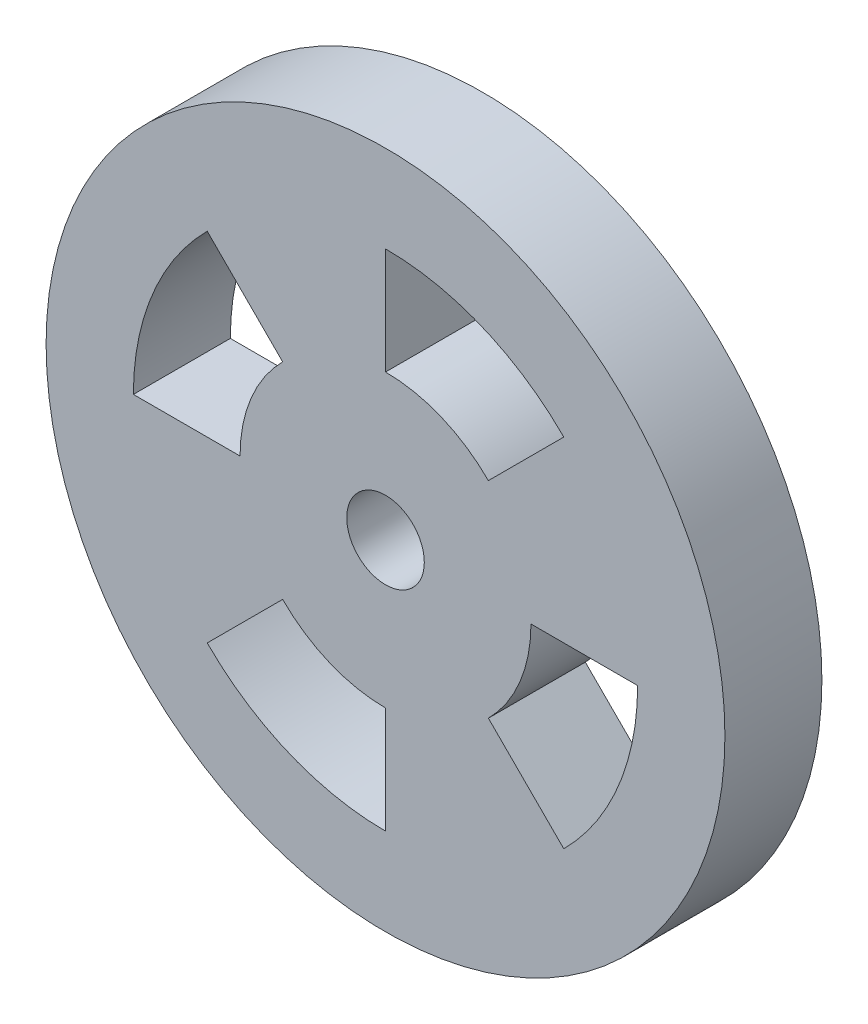
ISO-10303-21;
HEADER;
FILE_DESCRIPTION(('STEP AP214'),'2;1');
FILE_NAME('part.step','',(''),(''),'','','');
FILE_SCHEMA(('AUTOMOTIVE_DESIGN { 1 0 10303 214 1 1 1 1 }'));
ENDSEC;
DATA;
#1=APPLICATION_CONTEXT('core data for automotive mechanical design processes');
#2=APPLICATION_PROTOCOL_DEFINITION('international standard','automotive_design',2000,#1);
#3=PRODUCT_CONTEXT('',#1,'mechanical');
#4=PRODUCT('Part','Part','',(#3));
#5=PRODUCT_RELATED_PRODUCT_CATEGORY('part','',(#4));
#6=PRODUCT_DEFINITION_FORMATION('','',#4);
#7=PRODUCT_DEFINITION_CONTEXT('part definition',#1,'design');
#8=PRODUCT_DEFINITION('design','',#6,#7);
#9=PRODUCT_DEFINITION_SHAPE('','',#8);
#10=(LENGTH_UNIT() NAMED_UNIT(*) SI_UNIT(.MILLI.,.METRE.));
#11=(NAMED_UNIT(*) PLANE_ANGLE_UNIT() SI_UNIT($,.RADIAN.));
#12=(NAMED_UNIT(*) SI_UNIT($,.STERADIAN.) SOLID_ANGLE_UNIT());
#13=UNCERTAINTY_MEASURE_WITH_UNIT(LENGTH_MEASURE(1.E-05),#10,'distance_accuracy_value','');
#14=(GEOMETRIC_REPRESENTATION_CONTEXT(3) GLOBAL_UNCERTAINTY_ASSIGNED_CONTEXT((#13)) GLOBAL_UNIT_ASSIGNED_CONTEXT((#10,
#11,#12)) REPRESENTATION_CONTEXT('',''));
#15=CARTESIAN_POINT('',(0.,0.,0.));
#16=DIRECTION('',(0.,0.,1.));
#17=DIRECTION('',(1.,0.,0.));
#18=AXIS2_PLACEMENT_3D('',#15,#16,#17);
#19=CARTESIAN_POINT('',(0.,0.,1.));
#20=DIRECTION('',(0.,0.,1.));
#21=DIRECTION('',(1.,0.,0.));
#22=AXIS2_PLACEMENT_3D('',#19,#20,#21);
#23=PLANE('',#22);
#24=DIRECTION('',(-0.70710678118655,-0.707106781186545,0.));
#25=VECTOR('',#24,1.);
#26=CARTESIAN_POINT('',(0.,0.,1.));
#27=LINE('',#26,#25);
#28=CARTESIAN_POINT('',(1.83847763108501,1.83847763108504,1.));
#29=VERTEX_POINT('',#28);
#30=CARTESIAN_POINT('',(1.0606601717798,1.06066017177984,1.));
#31=VERTEX_POINT('',#30);
#32=EDGE_CURVE('E186',#29,#31,#27,.T.);
#33=ORIENTED_EDGE('',*,*,#32,.T.);
#34=CARTESIAN_POINT('',(0.,0.,1.));
#35=DIRECTION('',(0.,0.,1.));
#36=DIRECTION('',(1.,0.,0.));
#37=AXIS2_PLACEMENT_3D('',#34,#35,#36);
#38=CIRCLE('',#37,1.5);
#39=CARTESIAN_POINT('',(0.,1.5,1.));
#40=VERTEX_POINT('',#39);
#41=EDGE_CURVE('E163',#31,#40,#38,.T.);
#42=ORIENTED_EDGE('',*,*,#41,.T.);
#43=DIRECTION('',(0.,-1.,0.));
#44=VECTOR('',#43,1.);
#45=CARTESIAN_POINT('',(0.,0.,1.));
#46=LINE('',#45,#44);
#47=CARTESIAN_POINT('',(0.,2.6,1.));
#48=VERTEX_POINT('',#47);
#49=EDGE_CURVE('E197',#48,#40,#46,.T.);
#50=ORIENTED_EDGE('',*,*,#49,.F.);
#51=CARTESIAN_POINT('',(0.,0.,1.));
#52=DIRECTION('',(0.,0.,1.));
#53=DIRECTION('',(1.,0.,0.));
#54=AXIS2_PLACEMENT_3D('',#51,#52,#53);
#55=CIRCLE('',#54,2.6);
#56=EDGE_CURVE('E200',#29,#48,#55,.T.);
#57=ORIENTED_EDGE('',*,*,#56,.F.);
#58=EDGE_LOOP('',(#33,#42,#50,#57));
#59=FACE_BOUND('',#58,.T.);
#60=DIRECTION('',(0.70710678118655,0.707106781186545,0.));
#61=VECTOR('',#60,1.);
#62=CARTESIAN_POINT('',(0.,0.,1.));
#63=LINE('',#62,#61);
#64=CARTESIAN_POINT('',(-1.83847763108501,-1.83847763108504,1.));
#65=VERTEX_POINT('',#64);
#66=CARTESIAN_POINT('',(-1.0606601717798,-1.06066017177984,1.));
#67=VERTEX_POINT('',#66);
#68=EDGE_CURVE('E248',#65,#67,#63,.T.);
#69=ORIENTED_EDGE('',*,*,#68,.T.);
#70=CARTESIAN_POINT('',(0.,0.,1.));
#71=DIRECTION('',(0.,0.,1.));
#72=DIRECTION('',(1.,0.,0.));
#73=AXIS2_PLACEMENT_3D('',#70,#71,#72);
#74=CIRCLE('',#73,1.5);
#75=CARTESIAN_POINT('',(0.,-1.5,1.));
#76=VERTEX_POINT('',#75);
#77=EDGE_CURVE('E244',#67,#76,#74,.T.);
#78=ORIENTED_EDGE('',*,*,#77,.T.);
#79=DIRECTION('',(0.,1.,0.));
#80=VECTOR('',#79,1.);
#81=CARTESIAN_POINT('',(0.,0.,1.));
#82=LINE('',#81,#80);
#83=CARTESIAN_POINT('',(0.,-2.6,1.));
#84=VERTEX_POINT('',#83);
#85=EDGE_CURVE('E259',#84,#76,#82,.T.);
#86=ORIENTED_EDGE('',*,*,#85,.F.);
#87=CARTESIAN_POINT('',(0.,0.,1.));
#88=DIRECTION('',(0.,0.,1.));
#89=DIRECTION('',(1.,0.,0.));
#90=AXIS2_PLACEMENT_3D('',#87,#88,#89);
#91=CIRCLE('',#90,2.6);
#92=EDGE_CURVE('E262',#65,#84,#91,.T.);
#93=ORIENTED_EDGE('',*,*,#92,.F.);
#94=EDGE_LOOP('',(#69,#78,#86,#93));
#95=FACE_BOUND('',#94,.T.);
#96=CARTESIAN_POINT('',(0.,0.,1.));
#97=DIRECTION('',(0.,0.,1.));
#98=DIRECTION('',(1.,0.,0.));
#99=AXIS2_PLACEMENT_3D('',#96,#97,#98);
#100=CIRCLE('',#99,0.4);
#101=CARTESIAN_POINT('',(0.4,0.,1.));
#102=VERTEX_POINT('',#101);
#103=EDGE_CURVE('E275',#102,#102,#100,.T.);
#104=ORIENTED_EDGE('',*,*,#103,.F.);
#105=EDGE_LOOP('',(#104));
#106=FACE_BOUND('',#105,.T.);
#107=CARTESIAN_POINT('',(0.,0.,1.));
#108=DIRECTION('',(0.,0.,1.));
#109=DIRECTION('',(1.,0.,0.));
#110=AXIS2_PLACEMENT_3D('',#107,#108,#109);
#111=CIRCLE('',#110,3.5);
#112=CARTESIAN_POINT('',(3.5,0.,1.));
#113=VERTEX_POINT('',#112);
#114=EDGE_CURVE('E11',#113,#113,#111,.T.);
#115=ORIENTED_EDGE('',*,*,#114,.T.);
#116=EDGE_LOOP('',(#115));
#117=FACE_BOUND('',#116,.T.);
#118=DIRECTION('',(-0.707106781186547,0.707106781186548,0.));
#119=VECTOR('',#118,1.);
#120=CARTESIAN_POINT('',(0.,0.,1.));
#121=LINE('',#120,#119);
#122=CARTESIAN_POINT('',(1.83847763108504,-1.838477631085,1.));
#123=VERTEX_POINT('',#122);
#124=CARTESIAN_POINT('',(1.06066017177984,-1.0606601717798,1.));
#125=VERTEX_POINT('',#124);
#126=EDGE_CURVE('E217',#123,#125,#121,.T.);
#127=ORIENTED_EDGE('',*,*,#126,.T.);
#128=CARTESIAN_POINT('',(0.,0.,1.));
#129=DIRECTION('',(0.,0.,1.));
#130=DIRECTION('',(1.,0.,0.));
#131=AXIS2_PLACEMENT_3D('',#128,#129,#130);
#132=CIRCLE('',#131,1.5);
#133=CARTESIAN_POINT('',(1.5,0.,1.));
#134=VERTEX_POINT('',#133);
#135=EDGE_CURVE('E213',#125,#134,#132,.T.);
#136=ORIENTED_EDGE('',*,*,#135,.T.);
#137=DIRECTION('',(-1.,0.,0.));
#138=VECTOR('',#137,1.);
#139=CARTESIAN_POINT('',(0.,0.,1.));
#140=LINE('',#139,#138);
#141=CARTESIAN_POINT('',(2.6,0.,1.));
#142=VERTEX_POINT('',#141);
#143=EDGE_CURVE('E228',#142,#134,#140,.T.);
#144=ORIENTED_EDGE('',*,*,#143,.F.);
#145=CARTESIAN_POINT('',(0.,0.,1.));
#146=DIRECTION('',(0.,0.,1.));
#147=DIRECTION('',(1.,0.,0.));
#148=AXIS2_PLACEMENT_3D('',#145,#146,#147);
#149=CIRCLE('',#148,2.6);
#150=EDGE_CURVE('E231',#123,#142,#149,.T.);
#151=ORIENTED_EDGE('',*,*,#150,.F.);
#152=EDGE_LOOP('',(#127,#136,#144,#151));
#153=FACE_BOUND('',#152,.T.);
#154=DIRECTION('',(0.707106781186552,-0.707106781186543,0.));
#155=VECTOR('',#154,1.);
#156=CARTESIAN_POINT('',(0.,0.,1.));
#157=LINE('',#156,#155);
#158=CARTESIAN_POINT('',(-1.83847763108506,1.83847763108499,1.));
#159=VERTEX_POINT('',#158);
#160=CARTESIAN_POINT('',(-1.06066017177985,1.06066017177979,1.));
#161=VERTEX_POINT('',#160);
#162=EDGE_CURVE('E156',#159,#161,#157,.T.);
#163=ORIENTED_EDGE('',*,*,#162,.T.);
#164=CARTESIAN_POINT('',(0.,0.,1.));
#165=DIRECTION('',(0.,0.,1.));
#166=DIRECTION('',(1.,0.,0.));
#167=AXIS2_PLACEMENT_3D('',#164,#165,#166);
#168=CIRCLE('',#167,1.5);
#169=CARTESIAN_POINT('',(-1.5,0.,1.));
#170=VERTEX_POINT('',#169);
#171=EDGE_CURVE('E49',#161,#170,#168,.T.);
#172=ORIENTED_EDGE('',*,*,#171,.T.);
#173=DIRECTION('',(1.,0.,0.));
#174=VECTOR('',#173,1.);
#175=CARTESIAN_POINT('',(0.,0.,1.));
#176=LINE('',#175,#174);
#177=CARTESIAN_POINT('',(-2.6,0.,1.));
#178=VERTEX_POINT('',#177);
#179=EDGE_CURVE('E162',#178,#170,#176,.T.);
#180=ORIENTED_EDGE('',*,*,#179,.F.);
#181=CARTESIAN_POINT('',(0.,0.,1.));
#182=DIRECTION('',(0.,0.,1.));
#183=DIRECTION('',(1.,0.,0.));
#184=AXIS2_PLACEMENT_3D('',#181,#182,#183);
#185=CIRCLE('',#184,2.6);
#186=EDGE_CURVE('E174',#159,#178,#185,.T.);
#187=ORIENTED_EDGE('',*,*,#186,.F.);
#188=EDGE_LOOP('',(#163,#172,#180,#187));
#189=FACE_BOUND('',#188,.T.);
#190=ADVANCED_FACE('F34',(#59,#95,#106,#117,#153,#189),#23,.T.);
#191=CARTESIAN_POINT('',(0.,0.,0.));
#192=DIRECTION('',(0.,0.,1.));
#193=DIRECTION('',(1.,0.,0.));
#194=AXIS2_PLACEMENT_3D('',#191,#192,#193);
#195=PLANE('',#194);
#196=CARTESIAN_POINT('',(0.,0.,0.));
#197=DIRECTION('',(0.,0.,1.));
#198=DIRECTION('',(1.,0.,0.));
#199=AXIS2_PLACEMENT_3D('',#196,#197,#198);
#200=CIRCLE('',#199,1.5);
#201=CARTESIAN_POINT('',(1.0606601717798,1.06066017177984,0.));
#202=VERTEX_POINT('',#201);
#203=CARTESIAN_POINT('',(0.,1.5,0.));
#204=VERTEX_POINT('',#203);
#205=EDGE_CURVE('E183',#202,#204,#200,.T.);
#206=ORIENTED_EDGE('',*,*,#205,.F.);
#207=DIRECTION('',(-0.70710678118655,-0.707106781186545,0.));
#208=VECTOR('',#207,1.);
#209=CARTESIAN_POINT('',(0.,0.,0.));
#210=LINE('',#209,#208);
#211=CARTESIAN_POINT('',(1.83847763108501,1.83847763108504,0.));
#212=VERTEX_POINT('',#211);
#213=EDGE_CURVE('E192',#212,#202,#210,.T.);
#214=ORIENTED_EDGE('',*,*,#213,.F.);
#215=CARTESIAN_POINT('',(0.,0.,0.));
#216=DIRECTION('',(0.,0.,1.));
#217=DIRECTION('',(1.,0.,0.));
#218=AXIS2_PLACEMENT_3D('',#215,#216,#217);
#219=CIRCLE('',#218,2.6);
#220=CARTESIAN_POINT('',(0.,2.6,0.));
#221=VERTEX_POINT('',#220);
#222=EDGE_CURVE('E189',#212,#221,#219,.T.);
#223=ORIENTED_EDGE('',*,*,#222,.T.);
#224=DIRECTION('',(0.,-1.,0.));
#225=VECTOR('',#224,1.);
#226=CARTESIAN_POINT('',(0.,0.,0.));
#227=LINE('',#226,#225);
#228=EDGE_CURVE('E185',#221,#204,#227,.T.);
#229=ORIENTED_EDGE('',*,*,#228,.T.);
#230=EDGE_LOOP('',(#206,#214,#223,#229));
#231=FACE_BOUND('',#230,.T.);
#232=CARTESIAN_POINT('',(0.,0.,0.));
#233=DIRECTION('',(0.,0.,1.));
#234=DIRECTION('',(1.,0.,0.));
#235=AXIS2_PLACEMENT_3D('',#232,#233,#234);
#236=CIRCLE('',#235,1.5);
#237=CARTESIAN_POINT('',(-1.0606601717798,-1.06066017177984,0.));
#238=VERTEX_POINT('',#237);
#239=CARTESIAN_POINT('',(0.,-1.5,0.));
#240=VERTEX_POINT('',#239);
#241=EDGE_CURVE('E245',#238,#240,#236,.T.);
#242=ORIENTED_EDGE('',*,*,#241,.F.);
#243=DIRECTION('',(0.70710678118655,0.707106781186545,0.));
#244=VECTOR('',#243,1.);
#245=CARTESIAN_POINT('',(0.,0.,0.));
#246=LINE('',#245,#244);
#247=CARTESIAN_POINT('',(-1.83847763108501,-1.83847763108504,0.));
#248=VERTEX_POINT('',#247);
#249=EDGE_CURVE('E254',#248,#238,#246,.T.);
#250=ORIENTED_EDGE('',*,*,#249,.F.);
#251=CARTESIAN_POINT('',(0.,0.,0.));
#252=DIRECTION('',(0.,0.,1.));
#253=DIRECTION('',(1.,0.,0.));
#254=AXIS2_PLACEMENT_3D('',#251,#252,#253);
#255=CIRCLE('',#254,2.6);
#256=CARTESIAN_POINT('',(0.,-2.6,0.));
#257=VERTEX_POINT('',#256);
#258=EDGE_CURVE('E251',#248,#257,#255,.T.);
#259=ORIENTED_EDGE('',*,*,#258,.T.);
#260=DIRECTION('',(0.,1.,0.));
#261=VECTOR('',#260,1.);
#262=CARTESIAN_POINT('',(0.,0.,0.));
#263=LINE('',#262,#261);
#264=EDGE_CURVE('E247',#257,#240,#263,.T.);
#265=ORIENTED_EDGE('',*,*,#264,.T.);
#266=EDGE_LOOP('',(#242,#250,#259,#265));
#267=FACE_BOUND('',#266,.T.);
#268=CARTESIAN_POINT('',(0.,0.,0.));
#269=DIRECTION('',(0.,0.,1.));
#270=DIRECTION('',(1.,0.,0.));
#271=AXIS2_PLACEMENT_3D('',#268,#269,#270);
#272=CIRCLE('',#271,0.4);
#273=CARTESIAN_POINT('',(0.4,0.,0.));
#274=VERTEX_POINT('',#273);
#275=EDGE_CURVE('E276',#274,#274,#272,.T.);
#276=ORIENTED_EDGE('',*,*,#275,.T.);
#277=EDGE_LOOP('',(#276));
#278=FACE_BOUND('',#277,.T.);
#279=CARTESIAN_POINT('',(0.,0.,0.));
#280=DIRECTION('',(0.,0.,1.));
#281=DIRECTION('',(1.,0.,0.));
#282=AXIS2_PLACEMENT_3D('',#279,#280,#281);
#283=CIRCLE('',#282,3.5);
#284=CARTESIAN_POINT('',(3.5,0.,0.));
#285=VERTEX_POINT('',#284);
#286=EDGE_CURVE('E38',#285,#285,#283,.T.);
#287=ORIENTED_EDGE('',*,*,#286,.F.);
#288=EDGE_LOOP('',(#287));
#289=FACE_BOUND('',#288,.T.);
#290=CARTESIAN_POINT('',(0.,0.,0.));
#291=DIRECTION('',(0.,0.,1.));
#292=DIRECTION('',(1.,0.,0.));
#293=AXIS2_PLACEMENT_3D('',#290,#291,#292);
#294=CIRCLE('',#293,1.5);
#295=CARTESIAN_POINT('',(1.06066017177984,-1.0606601717798,0.));
#296=VERTEX_POINT('',#295);
#297=CARTESIAN_POINT('',(1.5,0.,0.));
#298=VERTEX_POINT('',#297);
#299=EDGE_CURVE('E214',#296,#298,#294,.T.);
#300=ORIENTED_EDGE('',*,*,#299,.F.);
#301=DIRECTION('',(-0.707106781186547,0.707106781186548,0.));
#302=VECTOR('',#301,1.);
#303=CARTESIAN_POINT('',(0.,0.,0.));
#304=LINE('',#303,#302);
#305=CARTESIAN_POINT('',(1.83847763108504,-1.838477631085,0.));
#306=VERTEX_POINT('',#305);
#307=EDGE_CURVE('E223',#306,#296,#304,.T.);
#308=ORIENTED_EDGE('',*,*,#307,.F.);
#309=CARTESIAN_POINT('',(0.,0.,0.));
#310=DIRECTION('',(0.,0.,1.));
#311=DIRECTION('',(1.,0.,0.));
#312=AXIS2_PLACEMENT_3D('',#309,#310,#311);
#313=CIRCLE('',#312,2.6);
#314=CARTESIAN_POINT('',(2.6,0.,0.));
#315=VERTEX_POINT('',#314);
#316=EDGE_CURVE('E220',#306,#315,#313,.T.);
#317=ORIENTED_EDGE('',*,*,#316,.T.);
#318=DIRECTION('',(-1.,0.,0.));
#319=VECTOR('',#318,1.);
#320=CARTESIAN_POINT('',(0.,0.,0.));
#321=LINE('',#320,#319);
#322=EDGE_CURVE('E216',#315,#298,#321,.T.);
#323=ORIENTED_EDGE('',*,*,#322,.T.);
#324=EDGE_LOOP('',(#300,#308,#317,#323));
#325=FACE_BOUND('',#324,.T.);
#326=CARTESIAN_POINT('',(0.,0.,0.));
#327=DIRECTION('',(0.,0.,1.));
#328=DIRECTION('',(1.,0.,0.));
#329=AXIS2_PLACEMENT_3D('',#326,#327,#328);
#330=CIRCLE('',#329,1.5);
#331=CARTESIAN_POINT('',(-1.06066017177985,1.06066017177979,0.));
#332=VERTEX_POINT('',#331);
#333=CARTESIAN_POINT('',(-1.5,0.,0.));
#334=VERTEX_POINT('',#333);
#335=EDGE_CURVE('E146',#332,#334,#330,.T.);
#336=ORIENTED_EDGE('',*,*,#335,.F.);
#337=DIRECTION('',(0.707106781186552,-0.707106781186543,0.));
#338=VECTOR('',#337,1.);
#339=CARTESIAN_POINT('',(0.,0.,0.));
#340=LINE('',#339,#338);
#341=CARTESIAN_POINT('',(-1.83847763108506,1.83847763108499,0.));
#342=VERTEX_POINT('',#341);
#343=EDGE_CURVE('E168',#342,#332,#340,.T.);
#344=ORIENTED_EDGE('',*,*,#343,.F.);
#345=CARTESIAN_POINT('',(0.,0.,0.));
#346=DIRECTION('',(0.,0.,1.));
#347=DIRECTION('',(1.,0.,0.));
#348=AXIS2_PLACEMENT_3D('',#345,#346,#347);
#349=CIRCLE('',#348,2.6);
#350=CARTESIAN_POINT('',(-2.6,0.,0.));
#351=VERTEX_POINT('',#350);
#352=EDGE_CURVE('E57',#342,#351,#349,.T.);
#353=ORIENTED_EDGE('',*,*,#352,.T.);
#354=DIRECTION('',(1.,0.,0.));
#355=VECTOR('',#354,1.);
#356=CARTESIAN_POINT('',(0.,0.,0.));
#357=LINE('',#356,#355);
#358=EDGE_CURVE('E155',#351,#334,#357,.T.);
#359=ORIENTED_EDGE('',*,*,#358,.T.);
#360=EDGE_LOOP('',(#336,#344,#353,#359));
#361=FACE_BOUND('',#360,.T.);
#362=ADVANCED_FACE('F166',(#231,#267,#278,#289,#325,#361),#195,.F.);
#363=CARTESIAN_POINT('',(0.,0.,1.));
#364=DIRECTION('',(0.,0.,-1.));
#365=DIRECTION('',(-1.,0.,0.));
#366=AXIS2_PLACEMENT_3D('',#363,#364,#365);
#367=CYLINDRICAL_SURFACE('',#366,3.5);
#368=ORIENTED_EDGE('',*,*,#114,.F.);
#369=EDGE_LOOP('',(#368));
#370=FACE_BOUND('',#369,.T.);
#371=ORIENTED_EDGE('',*,*,#286,.T.);
#372=EDGE_LOOP('',(#371));
#373=FACE_BOUND('',#372,.T.);
#374=ADVANCED_FACE('F36',(#370,#373),#367,.T.);
#375=CARTESIAN_POINT('',(0.,0.,0.));
#376=DIRECTION('',(0.,0.,1.));
#377=DIRECTION('',(1.,0.,0.));
#378=AXIS2_PLACEMENT_3D('',#375,#376,#377);
#379=CYLINDRICAL_SURFACE('',#378,0.4);
#380=ORIENTED_EDGE('',*,*,#275,.F.);
#381=EDGE_LOOP('',(#380));
#382=FACE_BOUND('',#381,.T.);
#383=ORIENTED_EDGE('',*,*,#103,.T.);
#384=EDGE_LOOP('',(#383));
#385=FACE_BOUND('',#384,.T.);
#386=ADVANCED_FACE('F282',(#382,#385),#379,.F.);
#387=CARTESIAN_POINT('',(0.,0.,0.));
#388=DIRECTION('',(0.,0.,1.));
#389=DIRECTION('',(1.,0.,0.));
#390=AXIS2_PLACEMENT_3D('',#387,#388,#389);
#391=CYLINDRICAL_SURFACE('',#390,1.5);
#392=ORIENTED_EDGE('',*,*,#77,.F.);
#393=DIRECTION('',(0.,0.,1.));
#394=VECTOR('',#393,1.);
#395=CARTESIAN_POINT('',(-1.0606601717798,-1.06066017177984,0.));
#396=LINE('',#395,#394);
#397=EDGE_CURVE('E256',#238,#67,#396,.T.);
#398=ORIENTED_EDGE('',*,*,#397,.F.);
#399=ORIENTED_EDGE('',*,*,#241,.T.);
#400=DIRECTION('',(0.,0.,1.));
#401=VECTOR('',#400,1.);
#402=CARTESIAN_POINT('',(0.,-1.5,0.));
#403=LINE('',#402,#401);
#404=EDGE_CURVE('E273',#240,#76,#403,.T.);
#405=ORIENTED_EDGE('',*,*,#404,.T.);
#406=EDGE_LOOP('',(#392,#398,#399,#405));
#407=FACE_BOUND('',#406,.T.);
#408=ADVANCED_FACE('F352',(#407),#391,.T.);
#409=CARTESIAN_POINT('',(0.,0.,0.));
#410=DIRECTION('',(1.,0.,0.));
#411=DIRECTION('',(0.,0.,-1.));
#412=AXIS2_PLACEMENT_3D('',#409,#410,#411);
#413=PLANE('',#412);
#414=ORIENTED_EDGE('',*,*,#85,.T.);
#415=ORIENTED_EDGE('',*,*,#404,.F.);
#416=ORIENTED_EDGE('',*,*,#264,.F.);
#417=DIRECTION('',(0.,0.,1.));
#418=VECTOR('',#417,1.);
#419=CARTESIAN_POINT('',(0.,-2.6,0.));
#420=LINE('',#419,#418);
#421=EDGE_CURVE('E271',#257,#84,#420,.T.);
#422=ORIENTED_EDGE('',*,*,#421,.T.);
#423=EDGE_LOOP('',(#414,#415,#416,#422));
#424=FACE_BOUND('',#423,.T.);
#425=ADVANCED_FACE('F348',(#424),#413,.F.);
#426=CARTESIAN_POINT('',(0.,0.,0.));
#427=DIRECTION('',(0.,0.,1.));
#428=DIRECTION('',(1.,0.,0.));
#429=AXIS2_PLACEMENT_3D('',#426,#427,#428);
#430=CYLINDRICAL_SURFACE('',#429,2.6);
#431=ORIENTED_EDGE('',*,*,#92,.T.);
#432=ORIENTED_EDGE('',*,*,#421,.F.);
#433=ORIENTED_EDGE('',*,*,#258,.F.);
#434=DIRECTION('',(0.,0.,1.));
#435=VECTOR('',#434,1.);
#436=CARTESIAN_POINT('',(-1.83847763108501,-1.83847763108504,0.));
#437=LINE('',#436,#435);
#438=EDGE_CURVE('E269',#248,#65,#437,.T.);
#439=ORIENTED_EDGE('',*,*,#438,.T.);
#440=EDGE_LOOP('',(#431,#432,#433,#439));
#441=FACE_BOUND('',#440,.T.);
#442=ADVANCED_FACE('F344',(#441),#430,.F.);
#443=CARTESIAN_POINT('',(0.,0.,0.));
#444=DIRECTION('',(0.707106781186545,-0.70710678118655,0.));
#445=DIRECTION('',(0.70710678118655,0.707106781186545,0.));
#446=AXIS2_PLACEMENT_3D('',#443,#444,#445);
#447=PLANE('',#446);
#448=ORIENTED_EDGE('',*,*,#68,.F.);
#449=ORIENTED_EDGE('',*,*,#438,.F.);
#450=ORIENTED_EDGE('',*,*,#249,.T.);
#451=ORIENTED_EDGE('',*,*,#397,.T.);
#452=EDGE_LOOP('',(#448,#449,#450,#451));
#453=FACE_BOUND('',#452,.T.);
#454=ADVANCED_FACE('F340',(#453),#447,.T.);
#455=CARTESIAN_POINT('',(0.,0.,0.));
#456=DIRECTION('',(0.,0.,1.));
#457=DIRECTION('',(1.,0.,0.));
#458=AXIS2_PLACEMENT_3D('',#455,#456,#457);
#459=CYLINDRICAL_SURFACE('',#458,1.5);
#460=ORIENTED_EDGE('',*,*,#135,.F.);
#461=DIRECTION('',(0.,0.,1.));
#462=VECTOR('',#461,1.);
#463=CARTESIAN_POINT('',(1.06066017177984,-1.0606601717798,0.));
#464=LINE('',#463,#462);
#465=EDGE_CURVE('E225',#296,#125,#464,.T.);
#466=ORIENTED_EDGE('',*,*,#465,.F.);
#467=ORIENTED_EDGE('',*,*,#299,.T.);
#468=DIRECTION('',(0.,0.,1.));
#469=VECTOR('',#468,1.);
#470=CARTESIAN_POINT('',(1.5,0.,0.));
#471=LINE('',#470,#469);
#472=EDGE_CURVE('E242',#298,#134,#471,.T.);
#473=ORIENTED_EDGE('',*,*,#472,.T.);
#474=EDGE_LOOP('',(#460,#466,#467,#473));
#475=FACE_BOUND('',#474,.T.);
#476=ADVANCED_FACE('F336',(#475),#459,.T.);
#477=CARTESIAN_POINT('',(0.,0.,0.));
#478=DIRECTION('',(0.,1.,0.));
#479=DIRECTION('',(-1.,0.,0.));
#480=AXIS2_PLACEMENT_3D('',#477,#478,#479);
#481=PLANE('',#480);
#482=ORIENTED_EDGE('',*,*,#143,.T.);
#483=ORIENTED_EDGE('',*,*,#472,.F.);
#484=ORIENTED_EDGE('',*,*,#322,.F.);
#485=DIRECTION('',(0.,0.,1.));
#486=VECTOR('',#485,1.);
#487=CARTESIAN_POINT('',(2.6,0.,0.));
#488=LINE('',#487,#486);
#489=EDGE_CURVE('E240',#315,#142,#488,.T.);
#490=ORIENTED_EDGE('',*,*,#489,.T.);
#491=EDGE_LOOP('',(#482,#483,#484,#490));
#492=FACE_BOUND('',#491,.T.);
#493=ADVANCED_FACE('F332',(#492),#481,.F.);
#494=CARTESIAN_POINT('',(0.,0.,0.));
#495=DIRECTION('',(0.,0.,1.));
#496=DIRECTION('',(1.,0.,0.));
#497=AXIS2_PLACEMENT_3D('',#494,#495,#496);
#498=CYLINDRICAL_SURFACE('',#497,2.6);
#499=ORIENTED_EDGE('',*,*,#150,.T.);
#500=ORIENTED_EDGE('',*,*,#489,.F.);
#501=ORIENTED_EDGE('',*,*,#316,.F.);
#502=DIRECTION('',(0.,0.,1.));
#503=VECTOR('',#502,1.);
#504=CARTESIAN_POINT('',(1.83847763108504,-1.838477631085,0.));
#505=LINE('',#504,#503);
#506=EDGE_CURVE('E238',#306,#123,#505,.T.);
#507=ORIENTED_EDGE('',*,*,#506,.T.);
#508=EDGE_LOOP('',(#499,#500,#501,#507));
#509=FACE_BOUND('',#508,.T.);
#510=ADVANCED_FACE('F328',(#509),#498,.F.);
#511=CARTESIAN_POINT('',(0.,0.,0.));
#512=DIRECTION('',(0.707106781186548,0.707106781186547,0.));
#513=DIRECTION('',(-0.707106781186547,0.707106781186548,0.));
#514=AXIS2_PLACEMENT_3D('',#511,#512,#513);
#515=PLANE('',#514);
#516=ORIENTED_EDGE('',*,*,#126,.F.);
#517=ORIENTED_EDGE('',*,*,#506,.F.);
#518=ORIENTED_EDGE('',*,*,#307,.T.);
#519=ORIENTED_EDGE('',*,*,#465,.T.);
#520=EDGE_LOOP('',(#516,#517,#518,#519));
#521=FACE_BOUND('',#520,.T.);
#522=ADVANCED_FACE('F324',(#521),#515,.T.);
#523=CARTESIAN_POINT('',(0.,0.,0.));
#524=DIRECTION('',(0.,0.,1.));
#525=DIRECTION('',(1.,0.,0.));
#526=AXIS2_PLACEMENT_3D('',#523,#524,#525);
#527=CYLINDRICAL_SURFACE('',#526,1.5);
#528=ORIENTED_EDGE('',*,*,#41,.F.);
#529=DIRECTION('',(0.,0.,1.));
#530=VECTOR('',#529,1.);
#531=CARTESIAN_POINT('',(1.0606601717798,1.06066017177984,0.));
#532=LINE('',#531,#530);
#533=EDGE_CURVE('E194',#202,#31,#532,.T.);
#534=ORIENTED_EDGE('',*,*,#533,.F.);
#535=ORIENTED_EDGE('',*,*,#205,.T.);
#536=DIRECTION('',(0.,0.,1.));
#537=VECTOR('',#536,1.);
#538=CARTESIAN_POINT('',(0.,1.5,0.));
#539=LINE('',#538,#537);
#540=EDGE_CURVE('E211',#204,#40,#539,.T.);
#541=ORIENTED_EDGE('',*,*,#540,.T.);
#542=EDGE_LOOP('',(#528,#534,#535,#541));
#543=FACE_BOUND('',#542,.T.);
#544=ADVANCED_FACE('F320',(#543),#527,.T.);
#545=CARTESIAN_POINT('',(0.,0.,0.));
#546=DIRECTION('',(-1.,0.,0.));
#547=DIRECTION('',(0.,0.,1.));
#548=AXIS2_PLACEMENT_3D('',#545,#546,#547);
#549=PLANE('',#548);
#550=ORIENTED_EDGE('',*,*,#49,.T.);
#551=ORIENTED_EDGE('',*,*,#540,.F.);
#552=ORIENTED_EDGE('',*,*,#228,.F.);
#553=DIRECTION('',(0.,0.,1.));
#554=VECTOR('',#553,1.);
#555=CARTESIAN_POINT('',(0.,2.6,0.));
#556=LINE('',#555,#554);
#557=EDGE_CURVE('E209',#221,#48,#556,.T.);
#558=ORIENTED_EDGE('',*,*,#557,.T.);
#559=EDGE_LOOP('',(#550,#551,#552,#558));
#560=FACE_BOUND('',#559,.T.);
#561=ADVANCED_FACE('F316',(#560),#549,.F.);
#562=CARTESIAN_POINT('',(0.,0.,0.));
#563=DIRECTION('',(0.,0.,1.));
#564=DIRECTION('',(1.,0.,0.));
#565=AXIS2_PLACEMENT_3D('',#562,#563,#564);
#566=CYLINDRICAL_SURFACE('',#565,2.6);
#567=ORIENTED_EDGE('',*,*,#56,.T.);
#568=ORIENTED_EDGE('',*,*,#557,.F.);
#569=ORIENTED_EDGE('',*,*,#222,.F.);
#570=DIRECTION('',(0.,0.,1.));
#571=VECTOR('',#570,1.);
#572=CARTESIAN_POINT('',(1.83847763108501,1.83847763108504,0.));
#573=LINE('',#572,#571);
#574=EDGE_CURVE('E207',#212,#29,#573,.T.);
#575=ORIENTED_EDGE('',*,*,#574,.T.);
#576=EDGE_LOOP('',(#567,#568,#569,#575));
#577=FACE_BOUND('',#576,.T.);
#578=ADVANCED_FACE('F312',(#577),#566,.F.);
#579=CARTESIAN_POINT('',(0.,0.,0.));
#580=DIRECTION('',(-0.707106781186545,0.70710678118655,0.));
#581=DIRECTION('',(-0.70710678118655,-0.707106781186545,0.));
#582=AXIS2_PLACEMENT_3D('',#579,#580,#581);
#583=PLANE('',#582);
#584=ORIENTED_EDGE('',*,*,#32,.F.);
#585=ORIENTED_EDGE('',*,*,#574,.F.);
#586=ORIENTED_EDGE('',*,*,#213,.T.);
#587=ORIENTED_EDGE('',*,*,#533,.T.);
#588=EDGE_LOOP('',(#584,#585,#586,#587));
#589=FACE_BOUND('',#588,.T.);
#590=ADVANCED_FACE('F309',(#589),#583,.T.);
#591=CARTESIAN_POINT('',(0.,0.,0.));
#592=DIRECTION('',(0.,0.,1.));
#593=DIRECTION('',(1.,0.,0.));
#594=AXIS2_PLACEMENT_3D('',#591,#592,#593);
#595=CYLINDRICAL_SURFACE('',#594,1.5);
#596=ORIENTED_EDGE('',*,*,#171,.F.);
#597=DIRECTION('',(0.,0.,1.));
#598=VECTOR('',#597,1.);
#599=CARTESIAN_POINT('',(-1.06066017177985,1.06066017177979,0.));
#600=LINE('',#599,#598);
#601=EDGE_CURVE('E151',#332,#161,#600,.T.);
#602=ORIENTED_EDGE('',*,*,#601,.F.);
#603=ORIENTED_EDGE('',*,*,#335,.T.);
#604=DIRECTION('',(0.,0.,1.));
#605=VECTOR('',#604,1.);
#606=CARTESIAN_POINT('',(-1.5,0.,0.));
#607=LINE('',#606,#605);
#608=EDGE_CURVE('E149',#334,#170,#607,.T.);
#609=ORIENTED_EDGE('',*,*,#608,.T.);
#610=EDGE_LOOP('',(#596,#602,#603,#609));
#611=FACE_BOUND('',#610,.T.);
#612=ADVANCED_FACE('F148',(#611),#595,.T.);
#613=CARTESIAN_POINT('',(0.,0.,0.));
#614=DIRECTION('',(0.,-1.,0.));
#615=DIRECTION('',(1.,0.,0.));
#616=AXIS2_PLACEMENT_3D('',#613,#614,#615);
#617=PLANE('',#616);
#618=ORIENTED_EDGE('',*,*,#179,.T.);
#619=ORIENTED_EDGE('',*,*,#608,.F.);
#620=ORIENTED_EDGE('',*,*,#358,.F.);
#621=DIRECTION('',(0.,0.,1.));
#622=VECTOR('',#621,1.);
#623=CARTESIAN_POINT('',(-2.6,0.,0.));
#624=LINE('',#623,#622);
#625=EDGE_CURVE('E164',#351,#178,#624,.T.);
#626=ORIENTED_EDGE('',*,*,#625,.T.);
#627=EDGE_LOOP('',(#618,#619,#620,#626));
#628=FACE_BOUND('',#627,.T.);
#629=ADVANCED_FACE('F160',(#628),#617,.F.);
#630=CARTESIAN_POINT('',(0.,0.,0.));
#631=DIRECTION('',(0.,0.,1.));
#632=DIRECTION('',(1.,0.,0.));
#633=AXIS2_PLACEMENT_3D('',#630,#631,#632);
#634=CYLINDRICAL_SURFACE('',#633,2.6);
#635=ORIENTED_EDGE('',*,*,#186,.T.);
#636=ORIENTED_EDGE('',*,*,#625,.F.);
#637=ORIENTED_EDGE('',*,*,#352,.F.);
#638=DIRECTION('',(0.,0.,1.));
#639=VECTOR('',#638,1.);
#640=CARTESIAN_POINT('',(-1.83847763108506,1.83847763108499,0.));
#641=LINE('',#640,#639);
#642=EDGE_CURVE('E180',#342,#159,#641,.T.);
#643=ORIENTED_EDGE('',*,*,#642,.T.);
#644=EDGE_LOOP('',(#635,#636,#637,#643));
#645=FACE_BOUND('',#644,.T.);
#646=ADVANCED_FACE('F297',(#645),#634,.F.);
#647=CARTESIAN_POINT('',(0.,0.,0.));
#648=DIRECTION('',(-0.707106781186543,-0.707106781186552,0.));
#649=DIRECTION('',(0.707106781186552,-0.707106781186543,0.));
#650=AXIS2_PLACEMENT_3D('',#647,#648,#649);
#651=PLANE('',#650);
#652=ORIENTED_EDGE('',*,*,#162,.F.);
#653=ORIENTED_EDGE('',*,*,#642,.F.);
#654=ORIENTED_EDGE('',*,*,#343,.T.);
#655=ORIENTED_EDGE('',*,*,#601,.T.);
#656=EDGE_LOOP('',(#652,#653,#654,#655));
#657=FACE_BOUND('',#656,.T.);
#658=ADVANCED_FACE('F296',(#657),#651,.T.);
#659=CLOSED_SHELL('',(#190,#362,#374,#386,#408,#425,#442,#454,#476,#493,#510,#522,#544,#561,
#578,#590,#612,#629,#646,#658));
#660=MANIFOLD_SOLID_BREP('B2',#659);
#661=ADVANCED_BREP_SHAPE_REPRESENTATION('',(#18,#660),#14);
#662=SHAPE_DEFINITION_REPRESENTATION(#9,#661);
ENDSEC;
END-ISO-10303-21;
